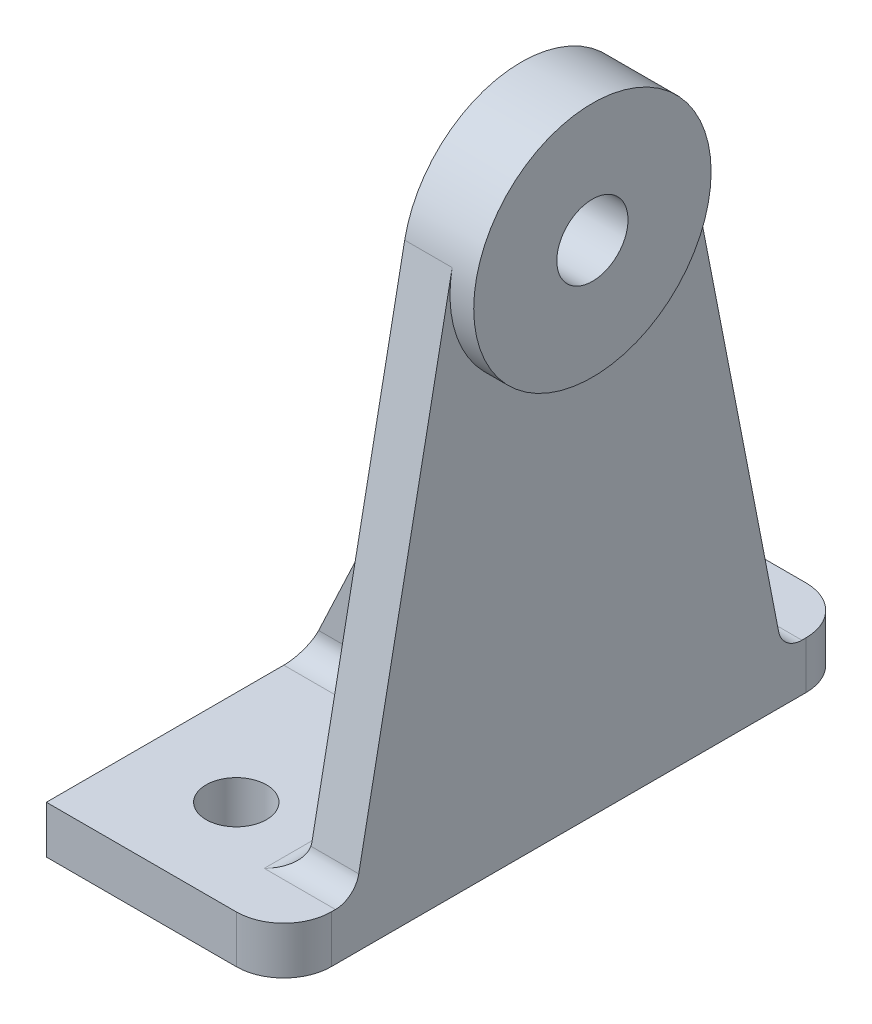
ISO-10303-21;
HEADER;
FILE_DESCRIPTION(('STEP AP214'),'2;1');
FILE_NAME('part.step','',(''),(''),'','','');
FILE_SCHEMA(('AUTOMOTIVE_DESIGN { 1 0 10303 214 1 1 1 1 }'));
ENDSEC;
DATA;
#1=APPLICATION_CONTEXT('core data for automotive mechanical design processes');
#2=APPLICATION_PROTOCOL_DEFINITION('international standard','automotive_design',2000,#1);
#3=PRODUCT_CONTEXT('',#1,'mechanical');
#4=PRODUCT('Part','Part','',(#3));
#5=PRODUCT_RELATED_PRODUCT_CATEGORY('part','',(#4));
#6=PRODUCT_DEFINITION_FORMATION('','',#4);
#7=PRODUCT_DEFINITION_CONTEXT('part definition',#1,'design');
#8=PRODUCT_DEFINITION('design','',#6,#7);
#9=PRODUCT_DEFINITION_SHAPE('','',#8);
#10=(LENGTH_UNIT() NAMED_UNIT(*) SI_UNIT(.MILLI.,.METRE.));
#11=(NAMED_UNIT(*) PLANE_ANGLE_UNIT() SI_UNIT($,.RADIAN.));
#12=(NAMED_UNIT(*) SI_UNIT($,.STERADIAN.) SOLID_ANGLE_UNIT());
#13=UNCERTAINTY_MEASURE_WITH_UNIT(LENGTH_MEASURE(1.E-05),#10,'distance_accuracy_value','');
#14=(GEOMETRIC_REPRESENTATION_CONTEXT(3) GLOBAL_UNCERTAINTY_ASSIGNED_CONTEXT((#13)) GLOBAL_UNIT_ASSIGNED_CONTEXT((#10,
#11,#12)) REPRESENTATION_CONTEXT('',''));
#15=CARTESIAN_POINT('',(0.,0.,0.));
#16=DIRECTION('',(0.,0.,1.));
#17=DIRECTION('',(1.,0.,0.));
#18=AXIS2_PLACEMENT_3D('',#15,#16,#17);
#19=CARTESIAN_POINT('',(31.75,0.,-76.2));
#20=DIRECTION('',(0.,1.,0.));
#21=DIRECTION('',(0.,0.,1.));
#22=AXIS2_PLACEMENT_3D('',#19,#20,#21);
#23=PLANE('',#22);
#24=CARTESIAN_POINT('',(12.7,0.,-63.5));
#25=DIRECTION('',(0.,1.,0.));
#26=DIRECTION('',(0.,0.,-1.));
#27=AXIS2_PLACEMENT_3D('',#24,#25,#26);
#28=CIRCLE('',#27,4.0386);
#29=CARTESIAN_POINT('',(12.7,0.,-67.5386));
#30=VERTEX_POINT('',#29);
#31=EDGE_CURVE('E200',#30,#30,#28,.T.);
#32=ORIENTED_EDGE('',*,*,#31,.F.);
#33=EDGE_LOOP('',(#32));
#34=FACE_BOUND('',#33,.T.);
#35=DIRECTION('',(0.,0.,-1.));
#36=VECTOR('',#35,1.);
#37=CARTESIAN_POINT('',(31.75,0.,0.));
#38=LINE('',#37,#36);
#39=CARTESIAN_POINT('',(31.75,0.,-69.2899631266922));
#40=VERTEX_POINT('',#39);
#41=CARTESIAN_POINT('',(31.75,0.,-69.85));
#42=VERTEX_POINT('',#41);
#43=EDGE_CURVE('E237',#40,#42,#38,.T.);
#44=ORIENTED_EDGE('',*,*,#43,.T.);
#45=CARTESIAN_POINT('',(25.4,0.,-69.85));
#46=DIRECTION('',(0.,1.,0.));
#47=DIRECTION('',(0.,0.,1.));
#48=AXIS2_PLACEMENT_3D('',#45,#46,#47);
#49=CIRCLE('',#48,6.35);
#50=CARTESIAN_POINT('',(25.4,0.,-76.2));
#51=VERTEX_POINT('',#50);
#52=EDGE_CURVE('E263',#42,#51,#49,.T.);
#53=ORIENTED_EDGE('',*,*,#52,.T.);
#54=DIRECTION('',(-1.,0.,0.));
#55=VECTOR('',#54,1.);
#56=CARTESIAN_POINT('',(31.75,0.,-76.2));
#57=LINE('',#56,#55);
#58=CARTESIAN_POINT('',(0.,0.,-76.2));
#59=VERTEX_POINT('',#58);
#60=EDGE_CURVE('E249',#51,#59,#57,.T.);
#61=ORIENTED_EDGE('',*,*,#60,.T.);
#62=DIRECTION('',(0.,0.,1.));
#63=VECTOR('',#62,1.);
#64=CARTESIAN_POINT('',(0.,0.,-76.2));
#65=LINE('',#64,#63);
#66=CARTESIAN_POINT('',(0.,0.,-44.45));
#67=VERTEX_POINT('',#66);
#68=EDGE_CURVE('E283',#59,#67,#65,.T.);
#69=ORIENTED_EDGE('',*,*,#68,.T.);
#70=DIRECTION('',(1.,0.,0.));
#71=VECTOR('',#70,1.);
#72=CARTESIAN_POINT('',(31.75,0.,-44.45));
#73=LINE('',#72,#71);
#74=CARTESIAN_POINT('',(22.225,0.,-44.45));
#75=VERTEX_POINT('',#74);
#76=EDGE_CURVE('E297',#67,#75,#73,.T.);
#77=ORIENTED_EDGE('',*,*,#76,.T.);
#78=DIRECTION('',(0.,0.,-1.));
#79=VECTOR('',#78,1.);
#80=CARTESIAN_POINT('',(22.225,0.,-76.2));
#81=LINE('',#80,#79);
#82=CARTESIAN_POINT('',(22.225,0.,-69.2899631266922));
#83=VERTEX_POINT('',#82);
#84=EDGE_CURVE('E349',#75,#83,#81,.T.);
#85=ORIENTED_EDGE('',*,*,#84,.T.);
#86=DIRECTION('',(1.,0.,0.));
#87=VECTOR('',#86,1.);
#88=CARTESIAN_POINT('',(31.75,0.,-69.2899631266922));
#89=LINE('',#88,#87);
#90=EDGE_CURVE('E236',#83,#40,#89,.T.);
#91=ORIENTED_EDGE('',*,*,#90,.T.);
#92=EDGE_LOOP('',(#44,#53,#61,#69,#77,#85,#91));
#93=FACE_BOUND('',#92,.T.);
#94=ADVANCED_FACE('F30',(#34,#93),#23,.T.);
#95=CARTESIAN_POINT('',(31.75,-6.35,0.));
#96=DIRECTION('',(1.,0.,0.));
#97=DIRECTION('',(0.,0.,-1.));
#98=AXIS2_PLACEMENT_3D('',#95,#96,#97);
#99=PLANE('',#98);
#100=DIRECTION('',(0.,0.,-1.));
#101=VECTOR('',#100,1.);
#102=CARTESIAN_POINT('',(31.75,-6.35,0.));
#103=LINE('',#102,#101);
#104=CARTESIAN_POINT('',(31.75,-6.35,-6.35));
#105=VERTEX_POINT('',#104);
#106=CARTESIAN_POINT('',(31.75,-6.35,-69.85));
#107=VERTEX_POINT('',#106);
#108=EDGE_CURVE('E282',#105,#107,#103,.T.);
#109=ORIENTED_EDGE('',*,*,#108,.T.);
#110=DIRECTION('',(0.,1.,0.));
#111=VECTOR('',#110,1.);
#112=CARTESIAN_POINT('',(31.75,-6.35,-69.85));
#113=LINE('',#112,#111);
#114=EDGE_CURVE('E259',#107,#42,#113,.T.);
#115=ORIENTED_EDGE('',*,*,#114,.T.);
#116=ORIENTED_EDGE('',*,*,#43,.F.);
#117=CARTESIAN_POINT('',(31.75,3.175,-69.2899631266922));
#118=DIRECTION('',(1.,0.,0.));
#119=DIRECTION('',(0.,0.,-1.));
#120=AXIS2_PLACEMENT_3D('',#117,#118,#119);
#121=CIRCLE('',#120,3.175);
#122=CARTESIAN_POINT('',(31.75,2.56648644053185,-66.1738218834326));
#123=VERTEX_POINT('',#122);
#124=EDGE_CURVE('E176',#40,#123,#121,.F.);
#125=ORIENTED_EDGE('',*,*,#124,.T.);
#126=DIRECTION('',(0.,0.981461808900657,0.191657814005716));
#127=VECTOR('',#126,1.);
#128=CARTESIAN_POINT('',(31.75,0.,-66.675));
#129=LINE('',#128,#127);
#130=CARTESIAN_POINT('',(31.75,66.5425677973356,-53.6807062162717));
#131=VERTEX_POINT('',#130);
#132=EDGE_CURVE('E167',#123,#131,#129,.T.);
#133=ORIENTED_EDGE('',*,*,#132,.T.);
#134=CARTESIAN_POINT('',(31.75,63.5,-38.1));
#135=DIRECTION('',(1.,0.,0.));
#136=DIRECTION('',(0.,0.,-1.));
#137=AXIS2_PLACEMENT_3D('',#134,#135,#136);
#138=CIRCLE('',#137,15.8749999999733);
#139=CARTESIAN_POINT('',(31.75,66.5425677973356,-22.5192937837283));
#140=VERTEX_POINT('',#139);
#141=EDGE_CURVE('E172',#140,#131,#138,.T.);
#142=ORIENTED_EDGE('',*,*,#141,.F.);
#143=DIRECTION('',(0.,-0.981461808900657,0.191657814005717));
#144=VECTOR('',#143,1.);
#145=CARTESIAN_POINT('',(31.75,0.,-9.525));
#146=LINE('',#145,#144);
#147=CARTESIAN_POINT('',(31.75,2.56648644053185,-10.0261781165674));
#148=VERTEX_POINT('',#147);
#149=EDGE_CURVE('E181',#140,#148,#146,.T.);
#150=ORIENTED_EDGE('',*,*,#149,.T.);
#151=CARTESIAN_POINT('',(31.75,3.175,-6.9100368733078));
#152=DIRECTION('',(1.,0.,0.));
#153=DIRECTION('',(0.,0.,-1.));
#154=AXIS2_PLACEMENT_3D('',#151,#152,#153);
#155=CIRCLE('',#154,3.175);
#156=CARTESIAN_POINT('',(31.75,0.,-6.91003687330779));
#157=VERTEX_POINT('',#156);
#158=EDGE_CURVE('E260',#148,#157,#155,.F.);
#159=ORIENTED_EDGE('',*,*,#158,.T.);
#160=CARTESIAN_POINT('',(31.75,0.,-6.35));
#161=VERTEX_POINT('',#160);
#162=EDGE_CURVE('E241',#161,#157,#38,.T.);
#163=ORIENTED_EDGE('',*,*,#162,.F.);
#164=DIRECTION('',(0.,1.,0.));
#165=VECTOR('',#164,1.);
#166=CARTESIAN_POINT('',(31.75,-6.35,-6.35));
#167=LINE('',#166,#165);
#168=EDGE_CURVE('E257',#161,#105,#167,.F.);
#169=ORIENTED_EDGE('',*,*,#168,.T.);
#170=EDGE_LOOP('',(#109,#115,#116,#125,#133,#142,#150,#159,#163,#169));
#171=FACE_BOUND('',#170,.T.);
#172=ADVANCED_FACE('F170',(#171),#99,.T.);
#173=CARTESIAN_POINT('',(0.,-6.35,0.));
#174=DIRECTION('',(0.,0.,1.));
#175=DIRECTION('',(1.,0.,0.));
#176=AXIS2_PLACEMENT_3D('',#173,#174,#175);
#177=PLANE('',#176);
#178=DIRECTION('',(1.,0.,0.));
#179=VECTOR('',#178,1.);
#180=CARTESIAN_POINT('',(0.,-6.35,0.));
#181=LINE('',#180,#179);
#182=CARTESIAN_POINT('',(0.,-6.35,0.));
#183=VERTEX_POINT('',#182);
#184=CARTESIAN_POINT('',(25.4,-6.35,0.));
#185=VERTEX_POINT('',#184);
#186=EDGE_CURVE('E247',#183,#185,#181,.T.);
#187=ORIENTED_EDGE('',*,*,#186,.T.);
#188=DIRECTION('',(0.,1.,0.));
#189=VECTOR('',#188,1.);
#190=CARTESIAN_POINT('',(25.4,-6.35,0.));
#191=LINE('',#190,#189);
#192=CARTESIAN_POINT('',(25.4,0.,0.));
#193=VERTEX_POINT('',#192);
#194=EDGE_CURVE('E38',#185,#193,#191,.T.);
#195=ORIENTED_EDGE('',*,*,#194,.T.);
#196=DIRECTION('',(1.,0.,0.));
#197=VECTOR('',#196,1.);
#198=CARTESIAN_POINT('',(0.,0.,0.));
#199=LINE('',#198,#197);
#200=CARTESIAN_POINT('',(0.,0.,0.));
#201=VERTEX_POINT('',#200);
#202=EDGE_CURVE('E274',#201,#193,#199,.T.);
#203=ORIENTED_EDGE('',*,*,#202,.F.);
#204=DIRECTION('',(0.,1.,0.));
#205=VECTOR('',#204,1.);
#206=CARTESIAN_POINT('',(0.,-6.35,0.));
#207=LINE('',#206,#205);
#208=EDGE_CURVE('E193',#183,#201,#207,.T.);
#209=ORIENTED_EDGE('',*,*,#208,.F.);
#210=EDGE_LOOP('',(#187,#195,#203,#209));
#211=FACE_BOUND('',#210,.T.);
#212=ADVANCED_FACE('F272',(#211),#177,.T.);
#213=CARTESIAN_POINT('',(0.,-6.35,-76.2));
#214=DIRECTION('',(-1.,0.,0.));
#215=DIRECTION('',(0.,0.,1.));
#216=AXIS2_PLACEMENT_3D('',#213,#214,#215);
#217=PLANE('',#216);
#218=CARTESIAN_POINT('',(0.,0.,-31.75));
#219=VERTEX_POINT('',#218);
#220=EDGE_CURVE('E280',#219,#201,#65,.T.);
#221=ORIENTED_EDGE('',*,*,#220,.F.);
#222=DIRECTION('',(0.,0.,1.));
#223=VECTOR('',#222,1.);
#224=CARTESIAN_POINT('',(0.,0.,-76.2));
#225=LINE('',#224,#223);
#226=EDGE_CURVE('E478',#67,#219,#225,.T.);
#227=ORIENTED_EDGE('',*,*,#226,.F.);
#228=ORIENTED_EDGE('',*,*,#68,.F.);
#229=DIRECTION('',(0.,1.,0.));
#230=VECTOR('',#229,1.);
#231=CARTESIAN_POINT('',(0.,-6.35,-76.2));
#232=LINE('',#231,#230);
#233=CARTESIAN_POINT('',(0.,-6.35,-76.2));
#234=VERTEX_POINT('',#233);
#235=EDGE_CURVE('E290',#234,#59,#232,.T.);
#236=ORIENTED_EDGE('',*,*,#235,.F.);
#237=DIRECTION('',(0.,0.,1.));
#238=VECTOR('',#237,1.);
#239=CARTESIAN_POINT('',(0.,-6.35,-76.2));
#240=LINE('',#239,#238);
#241=EDGE_CURVE('E385',#234,#183,#240,.T.);
#242=ORIENTED_EDGE('',*,*,#241,.T.);
#243=ORIENTED_EDGE('',*,*,#208,.T.);
#244=EDGE_LOOP('',(#221,#227,#228,#236,#242,#243));
#245=FACE_BOUND('',#244,.T.);
#246=ADVANCED_FACE('F389',(#245),#217,.T.);
#247=CARTESIAN_POINT('',(31.75,-6.35,-76.2));
#248=DIRECTION('',(0.,0.,-1.));
#249=DIRECTION('',(-1.,0.,0.));
#250=AXIS2_PLACEMENT_3D('',#247,#248,#249);
#251=PLANE('',#250);
#252=ORIENTED_EDGE('',*,*,#60,.F.);
#253=DIRECTION('',(0.,1.,0.));
#254=VECTOR('',#253,1.);
#255=CARTESIAN_POINT('',(25.4,-6.35,-76.2));
#256=LINE('',#255,#254);
#257=CARTESIAN_POINT('',(25.4,-6.35,-76.2));
#258=VERTEX_POINT('',#257);
#259=EDGE_CURVE('E265',#51,#258,#256,.F.);
#260=ORIENTED_EDGE('',*,*,#259,.T.);
#261=DIRECTION('',(-1.,0.,0.));
#262=VECTOR('',#261,1.);
#263=CARTESIAN_POINT('',(31.75,-6.35,-76.2));
#264=LINE('',#263,#262);
#265=EDGE_CURVE('E285',#258,#234,#264,.T.);
#266=ORIENTED_EDGE('',*,*,#265,.T.);
#267=ORIENTED_EDGE('',*,*,#235,.T.);
#268=EDGE_LOOP('',(#252,#260,#266,#267));
#269=FACE_BOUND('',#268,.T.);
#270=ADVANCED_FACE('F395',(#269),#251,.T.);
#271=CARTESIAN_POINT('',(31.75,-6.35,-76.2));
#272=DIRECTION('',(0.,1.,0.));
#273=DIRECTION('',(0.,0.,1.));
#274=AXIS2_PLACEMENT_3D('',#271,#272,#273);
#275=PLANE('',#274);
#276=ORIENTED_EDGE('',*,*,#265,.F.);
#277=CARTESIAN_POINT('',(25.4,-6.35,-69.85));
#278=DIRECTION('',(0.,1.,0.));
#279=DIRECTION('',(0.,0.,1.));
#280=AXIS2_PLACEMENT_3D('',#277,#278,#279);
#281=CIRCLE('',#280,6.35);
#282=EDGE_CURVE('E268',#258,#107,#281,.F.);
#283=ORIENTED_EDGE('',*,*,#282,.T.);
#284=ORIENTED_EDGE('',*,*,#108,.F.);
#285=CARTESIAN_POINT('',(25.4,-6.35,-6.35));
#286=DIRECTION('',(0.,1.,0.));
#287=DIRECTION('',(0.,0.,1.));
#288=AXIS2_PLACEMENT_3D('',#285,#286,#287);
#289=CIRCLE('',#288,6.35);
#290=EDGE_CURVE('E51',#105,#185,#289,.F.);
#291=ORIENTED_EDGE('',*,*,#290,.T.);
#292=ORIENTED_EDGE('',*,*,#186,.F.);
#293=ORIENTED_EDGE('',*,*,#241,.F.);
#294=EDGE_LOOP('',(#276,#283,#284,#291,#292,#293));
#295=FACE_BOUND('',#294,.T.);
#296=CARTESIAN_POINT('',(12.7,-6.35,-12.7));
#297=DIRECTION('',(0.,1.,0.));
#298=DIRECTION('',(0.,0.,1.));
#299=AXIS2_PLACEMENT_3D('',#296,#297,#298);
#300=CIRCLE('',#299,4.0386);
#301=CARTESIAN_POINT('',(12.7,-6.35,-8.6614));
#302=VERTEX_POINT('',#301);
#303=EDGE_CURVE('E242',#302,#302,#300,.T.);
#304=ORIENTED_EDGE('',*,*,#303,.T.);
#305=EDGE_LOOP('',(#304));
#306=FACE_BOUND('',#305,.T.);
#307=CARTESIAN_POINT('',(12.7,-6.35,-63.5));
#308=DIRECTION('',(0.,1.,0.));
#309=DIRECTION('',(0.,0.,-1.));
#310=AXIS2_PLACEMENT_3D('',#307,#308,#309);
#311=CIRCLE('',#310,4.0386);
#312=CARTESIAN_POINT('',(12.7,-6.35,-67.5386));
#313=VERTEX_POINT('',#312);
#314=EDGE_CURVE('E375',#313,#313,#311,.T.);
#315=ORIENTED_EDGE('',*,*,#314,.T.);
#316=EDGE_LOOP('',(#315));
#317=FACE_BOUND('',#316,.T.);
#318=ADVANCED_FACE('F391',(#295,#306,#317),#275,.F.);
#319=ORIENTED_EDGE('',*,*,#202,.T.);
#320=CARTESIAN_POINT('',(25.4,0.,-6.35));
#321=DIRECTION('',(0.,1.,0.));
#322=DIRECTION('',(0.,0.,1.));
#323=AXIS2_PLACEMENT_3D('',#320,#321,#322);
#324=CIRCLE('',#323,6.35);
#325=EDGE_CURVE('E11',#193,#161,#324,.T.);
#326=ORIENTED_EDGE('',*,*,#325,.T.);
#327=ORIENTED_EDGE('',*,*,#162,.T.);
#328=DIRECTION('',(1.,0.,0.));
#329=VECTOR('',#328,1.);
#330=CARTESIAN_POINT('',(25.4,0.,-6.9100368733078));
#331=LINE('',#330,#329);
#332=CARTESIAN_POINT('',(22.225,0.,-6.9100368733078));
#333=VERTEX_POINT('',#332);
#334=EDGE_CURVE('E192',#157,#333,#331,.F.);
#335=ORIENTED_EDGE('',*,*,#334,.T.);
#336=DIRECTION('',(0.,0.,-1.));
#337=VECTOR('',#336,1.);
#338=CARTESIAN_POINT('',(22.225,0.,-76.2));
#339=LINE('',#338,#337);
#340=CARTESIAN_POINT('',(22.225,0.,-31.75));
#341=VERTEX_POINT('',#340);
#342=EDGE_CURVE('E212',#333,#341,#339,.T.);
#343=ORIENTED_EDGE('',*,*,#342,.T.);
#344=DIRECTION('',(1.,0.,0.));
#345=VECTOR('',#344,1.);
#346=CARTESIAN_POINT('',(0.,0.,-31.75));
#347=LINE('',#346,#345);
#348=EDGE_CURVE('E215',#341,#219,#347,.F.);
#349=ORIENTED_EDGE('',*,*,#348,.T.);
#350=ORIENTED_EDGE('',*,*,#220,.T.);
#351=EDGE_LOOP('',(#319,#326,#327,#335,#343,#349,#350));
#352=FACE_BOUND('',#351,.T.);
#353=CARTESIAN_POINT('',(12.7,0.,-12.7));
#354=DIRECTION('',(0.,1.,0.));
#355=DIRECTION('',(0.,0.,1.));
#356=AXIS2_PLACEMENT_3D('',#353,#354,#355);
#357=CIRCLE('',#356,4.0386);
#358=CARTESIAN_POINT('',(12.7,0.,-8.6614));
#359=VERTEX_POINT('',#358);
#360=EDGE_CURVE('E378',#359,#359,#357,.T.);
#361=ORIENTED_EDGE('',*,*,#360,.F.);
#362=EDGE_LOOP('',(#361));
#363=FACE_BOUND('',#362,.T.);
#364=ADVANCED_FACE('F276',(#352,#363),#23,.T.);
#365=CARTESIAN_POINT('',(12.7,-6.35,-12.7));
#366=DIRECTION('',(0.,1.,0.));
#367=DIRECTION('',(0.,0.,1.));
#368=AXIS2_PLACEMENT_3D('',#365,#366,#367);
#369=CYLINDRICAL_SURFACE('',#368,4.0386);
#370=ORIENTED_EDGE('',*,*,#303,.F.);
#371=EDGE_LOOP('',(#370));
#372=FACE_BOUND('',#371,.T.);
#373=ORIENTED_EDGE('',*,*,#360,.T.);
#374=EDGE_LOOP('',(#373));
#375=FACE_BOUND('',#374,.T.);
#376=ADVANCED_FACE('F405',(#372,#375),#369,.F.);
#377=CARTESIAN_POINT('',(12.7,-6.35,-63.5));
#378=DIRECTION('',(0.,1.,0.));
#379=DIRECTION('',(0.,0.,1.));
#380=AXIS2_PLACEMENT_3D('',#377,#378,#379);
#381=CYLINDRICAL_SURFACE('',#380,4.0386);
#382=ORIENTED_EDGE('',*,*,#314,.F.);
#383=EDGE_LOOP('',(#382));
#384=FACE_BOUND('',#383,.T.);
#385=ORIENTED_EDGE('',*,*,#31,.T.);
#386=EDGE_LOOP('',(#385));
#387=FACE_BOUND('',#386,.T.);
#388=ADVANCED_FACE('F401',(#384,#387),#381,.F.);
#389=CARTESIAN_POINT('',(25.4,0.,-9.525));
#390=DIRECTION('',(0.,0.191657814005717,0.981461808900657));
#391=DIRECTION('',(0.,-0.981461808900657,0.191657814005717));
#392=AXIS2_PLACEMENT_3D('',#389,#390,#391);
#393=PLANE('',#392);
#394=CARTESIAN_POINT('',(22.225,3.175,-10.1450073746626));
#395=DIRECTION('',(0.,0.191657814005717,0.981461808900657));
#396=DIRECTION('',(0.,0.981461808900657,-0.191657814005717));
#397=AXIS2_PLACEMENT_3D('',#394,#395,#396);
#398=ELLIPSE('',#397,3.23497050135485,3.175);
#399=CARTESIAN_POINT('',(25.4,3.175,-10.1450073746626));
#400=VERTEX_POINT('',#399);
#401=CARTESIAN_POINT('',(25.3411412432596,2.56648644053185,-10.0261781165674));
#402=VERTEX_POINT('',#401);
#403=EDGE_CURVE('E302',#400,#402,#398,.F.);
#404=ORIENTED_EDGE('',*,*,#403,.T.);
#405=DIRECTION('',(1.,0.,0.));
#406=VECTOR('',#405,1.);
#407=CARTESIAN_POINT('',(31.75,2.56648644053185,-10.0261781165674));
#408=LINE('',#407,#406);
#409=EDGE_CURVE('E300',#402,#148,#408,.T.);
#410=ORIENTED_EDGE('',*,*,#409,.T.);
#411=ORIENTED_EDGE('',*,*,#149,.F.);
#412=DIRECTION('',(1.,0.,0.));
#413=VECTOR('',#412,1.);
#414=CARTESIAN_POINT('',(25.4,66.5425677973356,-22.5192937837283));
#415=LINE('',#414,#413);
#416=CARTESIAN_POINT('',(25.4,66.5425677973356,-22.5192937837283));
#417=VERTEX_POINT('',#416);
#418=EDGE_CURVE('E190',#417,#140,#415,.T.);
#419=ORIENTED_EDGE('',*,*,#418,.F.);
#420=DIRECTION('',(0.,-0.981461808900657,0.191657814005717));
#421=VECTOR('',#420,1.);
#422=CARTESIAN_POINT('',(25.4,0.,-9.525));
#423=LINE('',#422,#421);
#424=EDGE_CURVE('E180',#417,#400,#423,.T.);
#425=ORIENTED_EDGE('',*,*,#424,.T.);
#426=EDGE_LOOP('',(#404,#410,#411,#419,#425));
#427=FACE_BOUND('',#426,.T.);
#428=ADVANCED_FACE('F404',(#427),#393,.T.);
#429=CARTESIAN_POINT('',(25.4,63.5,-38.1));
#430=DIRECTION('',(1.,0.,0.));
#431=DIRECTION('',(0.,0.,-1.));
#432=AXIS2_PLACEMENT_3D('',#429,#430,#431);
#433=CYLINDRICAL_SURFACE('',#432,15.8749999999733);
#434=ORIENTED_EDGE('',*,*,#141,.T.);
#435=DIRECTION('',(1.,0.,0.));
#436=VECTOR('',#435,1.);
#437=CARTESIAN_POINT('',(25.4,66.5425677973356,-53.6807062162717));
#438=LINE('',#437,#436);
#439=CARTESIAN_POINT('',(25.4,66.5425677973356,-53.6807062162717));
#440=VERTEX_POINT('',#439);
#441=EDGE_CURVE('E188',#440,#131,#438,.T.);
#442=ORIENTED_EDGE('',*,*,#441,.F.);
#443=CARTESIAN_POINT('',(25.4,63.5,-38.1));
#444=DIRECTION('',(1.,0.,0.));
#445=DIRECTION('',(0.,0.,-1.));
#446=AXIS2_PLACEMENT_3D('',#443,#444,#445);
#447=CIRCLE('',#446,15.8749999999733);
#448=EDGE_CURVE('E198',#440,#417,#447,.T.);
#449=ORIENTED_EDGE('',*,*,#448,.T.);
#450=ORIENTED_EDGE('',*,*,#418,.T.);
#451=EDGE_LOOP('',(#434,#442,#449,#450));
#452=FACE_BOUND('',#451,.T.);
#453=CARTESIAN_POINT('',(34.925,63.5,-38.1));
#454=DIRECTION('',(1.,0.,0.));
#455=DIRECTION('',(0.,0.,-1.));
#456=AXIS2_PLACEMENT_3D('',#453,#454,#455);
#457=CIRCLE('',#456,15.8749999999733);
#458=CARTESIAN_POINT('',(34.925,63.5,-53.9749999999732));
#459=VERTEX_POINT('',#458);
#460=EDGE_CURVE('E479',#459,#459,#457,.T.);
#461=ORIENTED_EDGE('',*,*,#460,.F.);
#462=EDGE_LOOP('',(#461));
#463=FACE_BOUND('',#462,.T.);
#464=ADVANCED_FACE('F185',(#452,#463),#433,.T.);
#465=CARTESIAN_POINT('',(25.4,0.,-66.675));
#466=DIRECTION('',(0.,0.191657814005716,-0.981461808900657));
#467=DIRECTION('',(0.,0.981461808900657,0.191657814005716));
#468=AXIS2_PLACEMENT_3D('',#465,#466,#467);
#469=PLANE('',#468);
#470=ORIENTED_EDGE('',*,*,#132,.F.);
#471=DIRECTION('',(1.,0.,0.));
#472=VECTOR('',#471,1.);
#473=CARTESIAN_POINT('',(25.4,2.56648644053185,-66.1738218834326));
#474=LINE('',#473,#472);
#475=CARTESIAN_POINT('',(25.3411412432596,2.56648644053185,-66.1738218834326));
#476=VERTEX_POINT('',#475);
#477=EDGE_CURVE('E298',#123,#476,#474,.F.);
#478=ORIENTED_EDGE('',*,*,#477,.T.);
#479=CARTESIAN_POINT('',(22.225,3.175,-66.0549926253373));
#480=DIRECTION('',(0.,0.191657814005716,-0.981461808900657));
#481=DIRECTION('',(0.,-0.981461808900657,-0.191657814005716));
#482=AXIS2_PLACEMENT_3D('',#479,#480,#481);
#483=ELLIPSE('',#482,3.23497050135485,3.175);
#484=CARTESIAN_POINT('',(25.4,3.175,-66.0549926253373));
#485=VERTEX_POINT('',#484);
#486=EDGE_CURVE('E315',#476,#485,#483,.F.);
#487=ORIENTED_EDGE('',*,*,#486,.T.);
#488=DIRECTION('',(0.,0.981461808900657,0.191657814005716));
#489=VECTOR('',#488,1.);
#490=CARTESIAN_POINT('',(25.4,0.,-66.675));
#491=LINE('',#490,#489);
#492=EDGE_CURVE('E197',#485,#440,#491,.T.);
#493=ORIENTED_EDGE('',*,*,#492,.T.);
#494=ORIENTED_EDGE('',*,*,#441,.T.);
#495=EDGE_LOOP('',(#470,#478,#487,#493,#494));
#496=FACE_BOUND('',#495,.T.);
#497=ADVANCED_FACE('F195',(#496),#469,.T.);
#498=CARTESIAN_POINT('',(25.4,63.5,-38.1));
#499=DIRECTION('',(1.,0.,0.));
#500=DIRECTION('',(0.,0.,-1.));
#501=AXIS2_PLACEMENT_3D('',#498,#499,#500);
#502=PLANE('',#501);
#503=CARTESIAN_POINT('',(25.4,63.5,-38.1));
#504=DIRECTION('',(-1.,0.,0.));
#505=DIRECTION('',(0.,0.,1.));
#506=AXIS2_PLACEMENT_3D('',#503,#504,#505);
#507=CIRCLE('',#506,4.7625);
#508=CARTESIAN_POINT('',(25.4,63.5,-33.3375));
#509=VERTEX_POINT('',#508);
#510=EDGE_CURVE('E331',#509,#509,#507,.T.);
#511=ORIENTED_EDGE('',*,*,#510,.F.);
#512=EDGE_LOOP('',(#511));
#513=FACE_BOUND('',#512,.T.);
#514=DIRECTION('',(0.,-1.,0.));
#515=VECTOR('',#514,1.);
#516=CARTESIAN_POINT('',(25.4,63.5,-31.75));
#517=LINE('',#516,#515);
#518=CARTESIAN_POINT('',(25.4,54.102,-31.75));
#519=VERTEX_POINT('',#518);
#520=CARTESIAN_POINT('',(25.4,3.175,-31.75));
#521=VERTEX_POINT('',#520);
#522=EDGE_CURVE('E223',#519,#521,#517,.T.);
#523=ORIENTED_EDGE('',*,*,#522,.T.);
#524=DIRECTION('',(0.,0.,-1.));
#525=VECTOR('',#524,1.);
#526=CARTESIAN_POINT('',(25.4,3.175,-38.1));
#527=LINE('',#526,#525);
#528=EDGE_CURVE('E225',#521,#400,#527,.F.);
#529=ORIENTED_EDGE('',*,*,#528,.T.);
#530=ORIENTED_EDGE('',*,*,#424,.F.);
#531=ORIENTED_EDGE('',*,*,#448,.F.);
#532=ORIENTED_EDGE('',*,*,#492,.F.);
#533=DIRECTION('',(0.,0.,-1.));
#534=VECTOR('',#533,1.);
#535=CARTESIAN_POINT('',(25.4,3.175,-38.1));
#536=LINE('',#535,#534);
#537=CARTESIAN_POINT('',(25.4,3.175,-44.45));
#538=VERTEX_POINT('',#537);
#539=EDGE_CURVE('E218',#485,#538,#536,.F.);
#540=ORIENTED_EDGE('',*,*,#539,.T.);
#541=DIRECTION('',(0.,-1.,0.));
#542=VECTOR('',#541,1.);
#543=CARTESIAN_POINT('',(25.4,54.102,-44.45));
#544=LINE('',#543,#542);
#545=CARTESIAN_POINT('',(25.4,54.102,-44.45));
#546=VERTEX_POINT('',#545);
#547=EDGE_CURVE('E220',#538,#546,#544,.F.);
#548=ORIENTED_EDGE('',*,*,#547,.T.);
#549=DIRECTION('',(0.,0.,1.));
#550=VECTOR('',#549,1.);
#551=CARTESIAN_POINT('',(25.4,54.102,-38.1));
#552=LINE('',#551,#550);
#553=EDGE_CURVE('E368',#546,#519,#552,.T.);
#554=ORIENTED_EDGE('',*,*,#553,.T.);
#555=EDGE_LOOP('',(#523,#529,#530,#531,#532,#540,#548,#554));
#556=FACE_BOUND('',#555,.T.);
#557=ADVANCED_FACE('F367',(#513,#556),#502,.F.);
#558=CARTESIAN_POINT('',(34.925,63.5,-38.1));
#559=DIRECTION('',(1.,0.,0.));
#560=DIRECTION('',(0.,0.,-1.));
#561=AXIS2_PLACEMENT_3D('',#558,#559,#560);
#562=PLANE('',#561);
#563=CARTESIAN_POINT('',(34.925,63.5,-38.1));
#564=DIRECTION('',(-1.,0.,0.));
#565=DIRECTION('',(0.,0.,1.));
#566=AXIS2_PLACEMENT_3D('',#563,#564,#565);
#567=CIRCLE('',#566,4.7625);
#568=CARTESIAN_POINT('',(34.925,63.5,-33.3375));
#569=VERTEX_POINT('',#568);
#570=EDGE_CURVE('E465',#569,#569,#567,.T.);
#571=ORIENTED_EDGE('',*,*,#570,.T.);
#572=EDGE_LOOP('',(#571));
#573=FACE_BOUND('',#572,.T.);
#574=ORIENTED_EDGE('',*,*,#460,.T.);
#575=EDGE_LOOP('',(#574));
#576=FACE_BOUND('',#575,.T.);
#577=ADVANCED_FACE('F435',(#573,#576),#562,.T.);
#578=CARTESIAN_POINT('',(0.,0.,-38.1));
#579=DIRECTION('',(-0.905203581219027,0.424978207145083,0.));
#580=DIRECTION('',(-0.424978207145083,-0.905203581219027,0.));
#581=AXIS2_PLACEMENT_3D('',#578,#579,#580);
#582=PLANE('',#581);
#583=ORIENTED_EDGE('',*,*,#553,.F.);
#584=CARTESIAN_POINT('',(22.225,47.33925,-44.45));
#585=DIRECTION('',(-0.905203581219027,0.424978207145083,0.));
#586=DIRECTION('',(0.424978207145083,0.905203581219027,0.));
#587=AXIS2_PLACEMENT_3D('',#584,#585,#586);
#588=ELLIPSE('',#587,7.47097132657461,3.175);
#589=CARTESIAN_POINT('',(22.225,47.33925,-41.275));
#590=VERTEX_POINT('',#589);
#591=EDGE_CURVE('E310',#546,#590,#588,.F.);
#592=ORIENTED_EDGE('',*,*,#591,.T.);
#593=DIRECTION('',(-0.424978207145083,-0.905203581219027,0.));
#594=VECTOR('',#593,1.);
#595=CARTESIAN_POINT('',(25.4,54.102,-41.275));
#596=LINE('',#595,#594);
#597=CARTESIAN_POINT('',(1.4906103286385,3.17500000000001,-41.275));
#598=VERTEX_POINT('',#597);
#599=EDGE_CURVE('E469',#590,#598,#596,.T.);
#600=ORIENTED_EDGE('',*,*,#599,.T.);
#601=CARTESIAN_POINT('',(1.4906103286385,3.175,-44.45));
#602=DIRECTION('',(-0.905203581219027,0.424978207145083,0.));
#603=DIRECTION('',(0.424978207145083,0.905203581219027,0.));
#604=AXIS2_PLACEMENT_3D('',#601,#602,#603);
#605=ELLIPSE('',#604,3.50749827538714,3.175);
#606=EDGE_CURVE('E312',#598,#67,#605,.F.);
#607=ORIENTED_EDGE('',*,*,#606,.T.);
#608=ORIENTED_EDGE('',*,*,#226,.T.);
#609=CARTESIAN_POINT('',(1.49061032863849,3.175,-31.75));
#610=DIRECTION('',(-0.905203581219027,0.424978207145083,0.));
#611=DIRECTION('',(-0.424978207145083,-0.905203581219027,0.));
#612=AXIS2_PLACEMENT_3D('',#609,#610,#611);
#613=ELLIPSE('',#612,3.50749827538714,3.175);
#614=CARTESIAN_POINT('',(1.4906103286385,3.17500000000001,-34.925));
#615=VERTEX_POINT('',#614);
#616=EDGE_CURVE('E308',#219,#615,#613,.F.);
#617=ORIENTED_EDGE('',*,*,#616,.T.);
#618=DIRECTION('',(-0.424978207145083,-0.905203581219027,0.));
#619=VECTOR('',#618,1.);
#620=CARTESIAN_POINT('',(25.4,54.102,-34.925));
#621=LINE('',#620,#619);
#622=CARTESIAN_POINT('',(22.225,47.33925,-34.925));
#623=VERTEX_POINT('',#622);
#624=EDGE_CURVE('E472',#623,#615,#621,.T.);
#625=ORIENTED_EDGE('',*,*,#624,.F.);
#626=CARTESIAN_POINT('',(22.225,47.33925,-31.75));
#627=DIRECTION('',(-0.905203581219027,0.424978207145083,0.));
#628=DIRECTION('',(-0.424978207145083,-0.905203581219027,0.));
#629=AXIS2_PLACEMENT_3D('',#626,#627,#628);
#630=ELLIPSE('',#629,7.47097132657461,3.175);
#631=EDGE_CURVE('E305',#623,#519,#630,.F.);
#632=ORIENTED_EDGE('',*,*,#631,.T.);
#633=EDGE_LOOP('',(#583,#592,#600,#607,#608,#617,#625,#632));
#634=FACE_BOUND('',#633,.T.);
#635=ADVANCED_FACE('F439',(#634),#582,.T.);
#636=CARTESIAN_POINT('',(25.4,54.102,-34.925));
#637=DIRECTION('',(0.,0.,1.));
#638=DIRECTION('',(0.,-1.,0.));
#639=AXIS2_PLACEMENT_3D('',#636,#637,#638);
#640=PLANE('',#639);
#641=DIRECTION('',(1.,0.,0.));
#642=VECTOR('',#641,1.);
#643=CARTESIAN_POINT('',(25.4,3.175,-34.925));
#644=LINE('',#643,#642);
#645=CARTESIAN_POINT('',(22.225,3.175,-34.925));
#646=VERTEX_POINT('',#645);
#647=EDGE_CURVE('E227',#615,#646,#644,.T.);
#648=ORIENTED_EDGE('',*,*,#647,.T.);
#649=DIRECTION('',(0.,-1.,0.));
#650=VECTOR('',#649,1.);
#651=CARTESIAN_POINT('',(22.225,54.102,-34.925));
#652=LINE('',#651,#650);
#653=EDGE_CURVE('E229',#646,#623,#652,.F.);
#654=ORIENTED_EDGE('',*,*,#653,.T.);
#655=ORIENTED_EDGE('',*,*,#624,.T.);
#656=EDGE_LOOP('',(#648,#654,#655));
#657=FACE_BOUND('',#656,.T.);
#658=ADVANCED_FACE('F443',(#657),#640,.T.);
#659=CARTESIAN_POINT('',(25.4,54.102,-41.275));
#660=DIRECTION('',(0.,0.,1.));
#661=DIRECTION('',(0.,-1.,0.));
#662=AXIS2_PLACEMENT_3D('',#659,#660,#661);
#663=PLANE('',#662);
#664=ORIENTED_EDGE('',*,*,#599,.F.);
#665=DIRECTION('',(0.,-1.,0.));
#666=VECTOR('',#665,1.);
#667=CARTESIAN_POINT('',(22.225,0.,-41.275));
#668=LINE('',#667,#666);
#669=CARTESIAN_POINT('',(22.225,3.175,-41.275));
#670=VERTEX_POINT('',#669);
#671=EDGE_CURVE('E233',#590,#670,#668,.T.);
#672=ORIENTED_EDGE('',*,*,#671,.T.);
#673=DIRECTION('',(1.,0.,0.));
#674=VECTOR('',#673,1.);
#675=CARTESIAN_POINT('',(25.4,3.175,-41.275));
#676=LINE('',#675,#674);
#677=EDGE_CURVE('E231',#670,#598,#676,.F.);
#678=ORIENTED_EDGE('',*,*,#677,.T.);
#679=EDGE_LOOP('',(#664,#672,#678));
#680=FACE_BOUND('',#679,.T.);
#681=ADVANCED_FACE('F445',(#680),#663,.F.);
#682=CARTESIAN_POINT('',(34.925,63.5,-38.1));
#683=DIRECTION('',(-1.,0.,0.));
#684=DIRECTION('',(0.,0.,1.));
#685=AXIS2_PLACEMENT_3D('',#682,#683,#684);
#686=CYLINDRICAL_SURFACE('',#685,4.7625);
#687=ORIENTED_EDGE('',*,*,#570,.F.);
#688=EDGE_LOOP('',(#687));
#689=FACE_BOUND('',#688,.T.);
#690=ORIENTED_EDGE('',*,*,#510,.T.);
#691=EDGE_LOOP('',(#690));
#692=FACE_BOUND('',#691,.T.);
#693=ADVANCED_FACE('F448',(#689,#692),#686,.F.);
#694=CARTESIAN_POINT('',(25.4,3.175,-31.75));
#695=DIRECTION('',(-1.,0.,0.));
#696=DIRECTION('',(0.,0.,1.));
#697=AXIS2_PLACEMENT_3D('',#694,#695,#696);
#698=CYLINDRICAL_SURFACE('',#697,3.175);
#699=ORIENTED_EDGE('',*,*,#616,.F.);
#700=ORIENTED_EDGE('',*,*,#348,.F.);
#701=CARTESIAN_POINT('',(22.225,3.175,-31.75));
#702=DIRECTION('',(-1.,0.,0.));
#703=DIRECTION('',(0.,0.,1.));
#704=AXIS2_PLACEMENT_3D('',#701,#702,#703);
#705=CIRCLE('',#704,3.175);
#706=EDGE_CURVE('E328',#646,#341,#705,.T.);
#707=ORIENTED_EDGE('',*,*,#706,.F.);
#708=ORIENTED_EDGE('',*,*,#647,.F.);
#709=EDGE_LOOP('',(#699,#700,#707,#708));
#710=FACE_BOUND('',#709,.T.);
#711=ADVANCED_FACE('F454',(#710),#698,.F.);
#712=CARTESIAN_POINT('',(22.225,63.5,-31.75));
#713=DIRECTION('',(0.,-1.,0.));
#714=DIRECTION('',(0.,0.,-1.));
#715=AXIS2_PLACEMENT_3D('',#712,#713,#714);
#716=CYLINDRICAL_SURFACE('',#715,3.175);
#717=ORIENTED_EDGE('',*,*,#631,.F.);
#718=ORIENTED_EDGE('',*,*,#653,.F.);
#719=CARTESIAN_POINT('',(22.225,3.175,-31.75));
#720=DIRECTION('',(0.,1.,0.));
#721=DIRECTION('',(0.,0.,1.));
#722=AXIS2_PLACEMENT_3D('',#719,#720,#721);
#723=CIRCLE('',#722,3.175);
#724=EDGE_CURVE('E325',#521,#646,#723,.T.);
#725=ORIENTED_EDGE('',*,*,#724,.F.);
#726=ORIENTED_EDGE('',*,*,#522,.F.);
#727=EDGE_LOOP('',(#717,#718,#725,#726));
#728=FACE_BOUND('',#727,.T.);
#729=ADVANCED_FACE('F459',(#728),#716,.F.);
#730=CARTESIAN_POINT('',(25.4,3.175,-6.9100368733078));
#731=DIRECTION('',(-1.,0.,0.));
#732=DIRECTION('',(0.,0.,1.));
#733=AXIS2_PLACEMENT_3D('',#730,#731,#732);
#734=CYLINDRICAL_SURFACE('',#733,3.175);
#735=ORIENTED_EDGE('',*,*,#409,.F.);
#736=CARTESIAN_POINT('',(22.225,3.175,-6.9100368733078));
#737=DIRECTION('',(-0.707106781186547,0.,-0.707106781186548));
#738=DIRECTION('',(-0.707106781186547,0.,0.707106781186548));
#739=AXIS2_PLACEMENT_3D('',#736,#737,#738);
#740=ELLIPSE('',#739,4.49012806053458,3.175);
#741=EDGE_CURVE('E322',#333,#402,#740,.F.);
#742=ORIENTED_EDGE('',*,*,#741,.F.);
#743=ORIENTED_EDGE('',*,*,#334,.F.);
#744=ORIENTED_EDGE('',*,*,#158,.F.);
#745=EDGE_LOOP('',(#735,#742,#743,#744));
#746=FACE_BOUND('',#745,.T.);
#747=ADVANCED_FACE('F486',(#746),#734,.F.);
#748=CARTESIAN_POINT('',(22.225,3.175,-31.75));
#749=DIRECTION('',(0.,0.,1.));
#750=DIRECTION('',(1.,0.,0.));
#751=AXIS2_PLACEMENT_3D('',#748,#749,#750);
#752=SPHERICAL_SURFACE('',#751,3.175);
#753=ORIENTED_EDGE('',*,*,#724,.T.);
#754=ORIENTED_EDGE('',*,*,#706,.T.);
#755=CARTESIAN_POINT('',(22.225,3.175,-31.75));
#756=DIRECTION('',(0.,0.,1.));
#757=DIRECTION('',(1.,0.,0.));
#758=AXIS2_PLACEMENT_3D('',#755,#756,#757);
#759=CIRCLE('',#758,3.175);
#760=EDGE_CURVE('E320',#521,#341,#759,.F.);
#761=ORIENTED_EDGE('',*,*,#760,.F.);
#762=EDGE_LOOP('',(#753,#754,#761));
#763=FACE_BOUND('',#762,.T.);
#764=ADVANCED_FACE('F514',(#763),#752,.F.);
#765=CARTESIAN_POINT('',(22.225,3.175,-76.2));
#766=DIRECTION('',(0.,0.,-1.));
#767=DIRECTION('',(-1.,0.,0.));
#768=AXIS2_PLACEMENT_3D('',#765,#766,#767);
#769=CYLINDRICAL_SURFACE('',#768,3.175);
#770=ORIENTED_EDGE('',*,*,#403,.F.);
#771=ORIENTED_EDGE('',*,*,#528,.F.);
#772=ORIENTED_EDGE('',*,*,#760,.T.);
#773=ORIENTED_EDGE('',*,*,#342,.F.);
#774=ORIENTED_EDGE('',*,*,#741,.T.);
#775=EDGE_LOOP('',(#770,#771,#772,#773,#774));
#776=FACE_BOUND('',#775,.T.);
#777=ADVANCED_FACE('F502',(#776),#769,.F.);
#778=CARTESIAN_POINT('',(31.75,3.175,-69.2899631266922));
#779=DIRECTION('',(-1.,0.,0.));
#780=DIRECTION('',(0.,0.,1.));
#781=AXIS2_PLACEMENT_3D('',#778,#779,#780);
#782=CYLINDRICAL_SURFACE('',#781,3.175);
#783=ORIENTED_EDGE('',*,*,#124,.F.);
#784=ORIENTED_EDGE('',*,*,#90,.F.);
#785=CARTESIAN_POINT('',(22.225,3.175,-69.2899631266922));
#786=DIRECTION('',(-0.707106781186547,0.,0.707106781186547));
#787=DIRECTION('',(-0.707106781186547,0.,-0.707106781186547));
#788=AXIS2_PLACEMENT_3D('',#785,#786,#787);
#789=ELLIPSE('',#788,4.49012806053458,3.175);
#790=EDGE_CURVE('E255',#476,#83,#789,.F.);
#791=ORIENTED_EDGE('',*,*,#790,.F.);
#792=ORIENTED_EDGE('',*,*,#477,.F.);
#793=EDGE_LOOP('',(#783,#784,#791,#792));
#794=FACE_BOUND('',#793,.T.);
#795=ADVANCED_FACE('F353',(#794),#782,.F.);
#796=CARTESIAN_POINT('',(31.75,3.175,-44.45));
#797=DIRECTION('',(1.,0.,0.));
#798=DIRECTION('',(0.,0.,-1.));
#799=AXIS2_PLACEMENT_3D('',#796,#797,#798);
#800=CYLINDRICAL_SURFACE('',#799,3.175);
#801=ORIENTED_EDGE('',*,*,#606,.F.);
#802=ORIENTED_EDGE('',*,*,#677,.F.);
#803=CARTESIAN_POINT('',(22.225,3.175,-44.45));
#804=DIRECTION('',(-1.,0.,0.));
#805=DIRECTION('',(0.,0.,1.));
#806=AXIS2_PLACEMENT_3D('',#803,#804,#805);
#807=CIRCLE('',#806,3.175);
#808=EDGE_CURVE('E336',#75,#670,#807,.T.);
#809=ORIENTED_EDGE('',*,*,#808,.F.);
#810=ORIENTED_EDGE('',*,*,#76,.F.);
#811=EDGE_LOOP('',(#801,#802,#809,#810));
#812=FACE_BOUND('',#811,.T.);
#813=ADVANCED_FACE('F359',(#812),#800,.F.);
#814=CARTESIAN_POINT('',(22.225,3.175,-76.2));
#815=DIRECTION('',(0.,0.,-1.));
#816=DIRECTION('',(-1.,0.,0.));
#817=AXIS2_PLACEMENT_3D('',#814,#815,#816);
#818=CYLINDRICAL_SURFACE('',#817,3.175);
#819=ORIENTED_EDGE('',*,*,#790,.T.);
#820=ORIENTED_EDGE('',*,*,#84,.F.);
#821=CARTESIAN_POINT('',(22.225,3.175,-44.45));
#822=DIRECTION('',(0.,0.,-1.));
#823=DIRECTION('',(-1.,0.,0.));
#824=AXIS2_PLACEMENT_3D('',#821,#822,#823);
#825=CIRCLE('',#824,3.175);
#826=EDGE_CURVE('E334',#538,#75,#825,.T.);
#827=ORIENTED_EDGE('',*,*,#826,.F.);
#828=ORIENTED_EDGE('',*,*,#539,.F.);
#829=ORIENTED_EDGE('',*,*,#486,.F.);
#830=EDGE_LOOP('',(#819,#820,#827,#828,#829));
#831=FACE_BOUND('',#830,.T.);
#832=ADVANCED_FACE('F347',(#831),#818,.F.);
#833=CARTESIAN_POINT('',(22.225,3.175,-44.45));
#834=DIRECTION('',(0.,0.,1.));
#835=DIRECTION('',(1.,0.,0.));
#836=AXIS2_PLACEMENT_3D('',#833,#834,#835);
#837=SPHERICAL_SURFACE('',#836,3.175);
#838=ORIENTED_EDGE('',*,*,#826,.T.);
#839=ORIENTED_EDGE('',*,*,#808,.T.);
#840=CARTESIAN_POINT('',(22.225,3.175,-44.45));
#841=DIRECTION('',(0.,1.,0.));
#842=DIRECTION('',(0.,0.,1.));
#843=AXIS2_PLACEMENT_3D('',#840,#841,#842);
#844=CIRCLE('',#843,3.175);
#845=EDGE_CURVE('E332',#538,#670,#844,.F.);
#846=ORIENTED_EDGE('',*,*,#845,.F.);
#847=EDGE_LOOP('',(#838,#839,#846));
#848=FACE_BOUND('',#847,.T.);
#849=ADVANCED_FACE('F360',(#848),#837,.F.);
#850=CARTESIAN_POINT('',(22.225,54.102,-44.45));
#851=DIRECTION('',(0.,1.,0.));
#852=DIRECTION('',(0.,0.,1.));
#853=AXIS2_PLACEMENT_3D('',#850,#851,#852);
#854=CYLINDRICAL_SURFACE('',#853,3.175);
#855=ORIENTED_EDGE('',*,*,#591,.F.);
#856=ORIENTED_EDGE('',*,*,#547,.F.);
#857=ORIENTED_EDGE('',*,*,#845,.T.);
#858=ORIENTED_EDGE('',*,*,#671,.F.);
#859=EDGE_LOOP('',(#855,#856,#857,#858));
#860=FACE_BOUND('',#859,.T.);
#861=ADVANCED_FACE('F364',(#860),#854,.F.);
#862=CARTESIAN_POINT('',(25.4,-6.35,-69.85));
#863=DIRECTION('',(0.,1.,0.));
#864=DIRECTION('',(0.,0.,1.));
#865=AXIS2_PLACEMENT_3D('',#862,#863,#864);
#866=CYLINDRICAL_SURFACE('',#865,6.35);
#867=ORIENTED_EDGE('',*,*,#282,.F.);
#868=ORIENTED_EDGE('',*,*,#259,.F.);
#869=ORIENTED_EDGE('',*,*,#52,.F.);
#870=ORIENTED_EDGE('',*,*,#114,.F.);
#871=EDGE_LOOP('',(#867,#868,#869,#870));
#872=FACE_BOUND('',#871,.T.);
#873=ADVANCED_FACE('F490',(#872),#866,.T.);
#874=CARTESIAN_POINT('',(25.4,-6.35,-6.35));
#875=DIRECTION('',(0.,1.,0.));
#876=DIRECTION('',(0.,0.,1.));
#877=AXIS2_PLACEMENT_3D('',#874,#875,#876);
#878=CYLINDRICAL_SURFACE('',#877,6.35);
#879=ORIENTED_EDGE('',*,*,#290,.F.);
#880=ORIENTED_EDGE('',*,*,#168,.F.);
#881=ORIENTED_EDGE('',*,*,#325,.F.);
#882=ORIENTED_EDGE('',*,*,#194,.F.);
#883=EDGE_LOOP('',(#879,#880,#881,#882));
#884=FACE_BOUND('',#883,.T.);
#885=ADVANCED_FACE('F32',(#884),#878,.T.);
#886=CLOSED_SHELL('',(#94,#172,#212,#246,#270,#318,#364,#376,#388,#428,#464,#497,#557,#577,#635,
#658,#681,#693,#711,#729,#747,#764,#777,#795,#813,#832,#849,#861,#873,#885));
#887=MANIFOLD_SOLID_BREP('B2',#886);
#888=ADVANCED_BREP_SHAPE_REPRESENTATION('',(#18,#887),#14);
#889=SHAPE_DEFINITION_REPRESENTATION(#9,#888);
ENDSEC;
END-ISO-10303-21;
